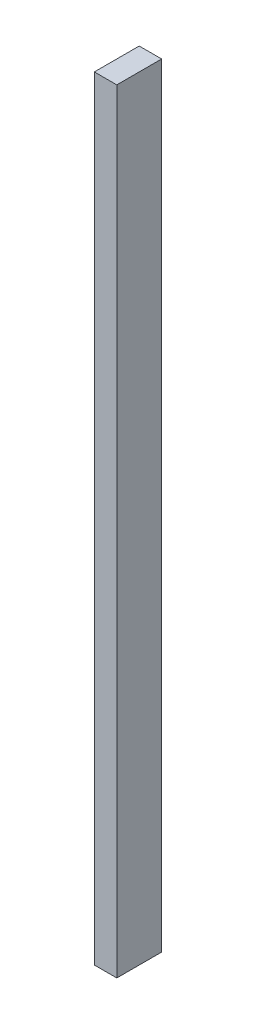
ISO-10303-21;
HEADER;
FILE_DESCRIPTION(('STEP AP214'),'2;1');
FILE_NAME('part.step','',(''),(''),'','','');
FILE_SCHEMA(('AUTOMOTIVE_DESIGN { 1 0 10303 214 1 1 1 1 }'));
ENDSEC;
DATA;
#1=APPLICATION_CONTEXT('core data for automotive mechanical design processes');
#2=APPLICATION_PROTOCOL_DEFINITION('international standard','automotive_design',2000,#1);
#3=PRODUCT_CONTEXT('',#1,'mechanical');
#4=PRODUCT('Part','Part','',(#3));
#5=PRODUCT_RELATED_PRODUCT_CATEGORY('part','',(#4));
#6=PRODUCT_DEFINITION_FORMATION('','',#4);
#7=PRODUCT_DEFINITION_CONTEXT('part definition',#1,'design');
#8=PRODUCT_DEFINITION('design','',#6,#7);
#9=PRODUCT_DEFINITION_SHAPE('','',#8);
#10=(LENGTH_UNIT() NAMED_UNIT(*) SI_UNIT(.MILLI.,.METRE.));
#11=(NAMED_UNIT(*) PLANE_ANGLE_UNIT() SI_UNIT($,.RADIAN.));
#12=(NAMED_UNIT(*) SI_UNIT($,.STERADIAN.) SOLID_ANGLE_UNIT());
#13=UNCERTAINTY_MEASURE_WITH_UNIT(LENGTH_MEASURE(1.E-05),#10,'distance_accuracy_value','');
#14=(GEOMETRIC_REPRESENTATION_CONTEXT(3) GLOBAL_UNCERTAINTY_ASSIGNED_CONTEXT((#13)) GLOBAL_UNIT_ASSIGNED_CONTEXT((#10,
#11,#12)) REPRESENTATION_CONTEXT('',''));
#15=CARTESIAN_POINT('',(0.,0.,0.));
#16=DIRECTION('',(0.,0.,1.));
#17=DIRECTION('',(1.,0.,0.));
#18=AXIS2_PLACEMENT_3D('',#15,#16,#17);
#19=CARTESIAN_POINT('',(12.7,875.792,25.4));
#20=DIRECTION('',(-1.,0.,0.));
#21=DIRECTION('',(0.,0.,1.));
#22=AXIS2_PLACEMENT_3D('',#19,#20,#21);
#23=PLANE('',#22);
#24=DIRECTION('',(0.,0.,-1.));
#25=VECTOR('',#24,1.);
#26=CARTESIAN_POINT('',(12.7,0.,25.4));
#27=LINE('',#26,#25);
#28=CARTESIAN_POINT('',(12.7,0.,25.4));
#29=VERTEX_POINT('',#28);
#30=CARTESIAN_POINT('',(12.7,0.,-25.4));
#31=VERTEX_POINT('',#30);
#32=EDGE_CURVE('E111',#29,#31,#27,.T.);
#33=ORIENTED_EDGE('',*,*,#32,.T.);
#34=DIRECTION('',(0.,-1.,0.));
#35=VECTOR('',#34,1.);
#36=CARTESIAN_POINT('',(12.7,875.792,-25.4));
#37=LINE('',#36,#35);
#38=CARTESIAN_POINT('',(12.7,875.792,-25.4));
#39=VERTEX_POINT('',#38);
#40=EDGE_CURVE('E11',#39,#31,#37,.T.);
#41=ORIENTED_EDGE('',*,*,#40,.F.);
#42=DIRECTION('',(0.,0.,-1.));
#43=VECTOR('',#42,1.);
#44=CARTESIAN_POINT('',(12.7,875.792,25.4));
#45=LINE('',#44,#43);
#46=CARTESIAN_POINT('',(12.7,875.792,25.4));
#47=VERTEX_POINT('',#46);
#48=EDGE_CURVE('E95',#47,#39,#45,.T.);
#49=ORIENTED_EDGE('',*,*,#48,.F.);
#50=DIRECTION('',(0.,-1.,0.));
#51=VECTOR('',#50,1.);
#52=CARTESIAN_POINT('',(12.7,875.792,25.4));
#53=LINE('',#52,#51);
#54=EDGE_CURVE('E107',#47,#29,#53,.T.);
#55=ORIENTED_EDGE('',*,*,#54,.T.);
#56=EDGE_LOOP('',(#33,#41,#49,#55));
#57=FACE_BOUND('',#56,.T.);
#58=ADVANCED_FACE('F43',(#57),#23,.F.);
#59=CARTESIAN_POINT('',(-12.7,875.792,-25.4));
#60=DIRECTION('',(0.,0.,1.));
#61=DIRECTION('',(1.,0.,0.));
#62=AXIS2_PLACEMENT_3D('',#59,#60,#61);
#63=PLANE('',#62);
#64=DIRECTION('',(-1.,0.,0.));
#65=VECTOR('',#64,1.);
#66=CARTESIAN_POINT('',(-12.7,0.,-25.4));
#67=LINE('',#66,#65);
#68=CARTESIAN_POINT('',(-12.7,0.,-25.4));
#69=VERTEX_POINT('',#68);
#70=EDGE_CURVE('E100',#31,#69,#67,.T.);
#71=ORIENTED_EDGE('',*,*,#70,.T.);
#72=DIRECTION('',(0.,-1.,0.));
#73=VECTOR('',#72,1.);
#74=CARTESIAN_POINT('',(-12.7,875.792,-25.4));
#75=LINE('',#74,#73);
#76=CARTESIAN_POINT('',(-12.7,875.792,-25.4));
#77=VERTEX_POINT('',#76);
#78=EDGE_CURVE('E52',#77,#69,#75,.T.);
#79=ORIENTED_EDGE('',*,*,#78,.F.);
#80=DIRECTION('',(-1.,0.,0.));
#81=VECTOR('',#80,1.);
#82=CARTESIAN_POINT('',(-12.7,875.792,-25.4));
#83=LINE('',#82,#81);
#84=EDGE_CURVE('E90',#39,#77,#83,.T.);
#85=ORIENTED_EDGE('',*,*,#84,.F.);
#86=ORIENTED_EDGE('',*,*,#40,.T.);
#87=EDGE_LOOP('',(#71,#79,#85,#86));
#88=FACE_BOUND('',#87,.T.);
#89=ADVANCED_FACE('F99',(#88),#63,.F.);
#90=CARTESIAN_POINT('',(-12.7,875.792,25.4));
#91=DIRECTION('',(1.,0.,0.));
#92=DIRECTION('',(0.,0.,-1.));
#93=AXIS2_PLACEMENT_3D('',#90,#91,#92);
#94=PLANE('',#93);
#95=DIRECTION('',(0.,0.,1.));
#96=VECTOR('',#95,1.);
#97=CARTESIAN_POINT('',(-12.7,0.,25.4));
#98=LINE('',#97,#96);
#99=CARTESIAN_POINT('',(-12.7,0.,25.4));
#100=VERTEX_POINT('',#99);
#101=EDGE_CURVE('E77',#69,#100,#98,.T.);
#102=ORIENTED_EDGE('',*,*,#101,.T.);
#103=DIRECTION('',(0.,-1.,0.));
#104=VECTOR('',#103,1.);
#105=CARTESIAN_POINT('',(-12.7,875.792,25.4));
#106=LINE('',#105,#104);
#107=CARTESIAN_POINT('',(-12.7,875.792,25.4));
#108=VERTEX_POINT('',#107);
#109=EDGE_CURVE('E102',#108,#100,#106,.T.);
#110=ORIENTED_EDGE('',*,*,#109,.F.);
#111=DIRECTION('',(0.,0.,1.));
#112=VECTOR('',#111,1.);
#113=CARTESIAN_POINT('',(-12.7,875.792,25.4));
#114=LINE('',#113,#112);
#115=EDGE_CURVE('E93',#77,#108,#114,.T.);
#116=ORIENTED_EDGE('',*,*,#115,.F.);
#117=ORIENTED_EDGE('',*,*,#78,.T.);
#118=EDGE_LOOP('',(#102,#110,#116,#117));
#119=FACE_BOUND('',#118,.T.);
#120=ADVANCED_FACE('F103',(#119),#94,.F.);
#121=CARTESIAN_POINT('',(-12.7,875.792,25.4));
#122=DIRECTION('',(0.,0.,-1.));
#123=DIRECTION('',(-1.,0.,0.));
#124=AXIS2_PLACEMENT_3D('',#121,#122,#123);
#125=PLANE('',#124);
#126=DIRECTION('',(1.,0.,0.));
#127=VECTOR('',#126,1.);
#128=CARTESIAN_POINT('',(-12.7,0.,25.4));
#129=LINE('',#128,#127);
#130=EDGE_CURVE('E83',#100,#29,#129,.T.);
#131=ORIENTED_EDGE('',*,*,#130,.T.);
#132=ORIENTED_EDGE('',*,*,#54,.F.);
#133=DIRECTION('',(1.,0.,0.));
#134=VECTOR('',#133,1.);
#135=CARTESIAN_POINT('',(-12.7,875.792,25.4));
#136=LINE('',#135,#134);
#137=EDGE_CURVE('E60',#108,#47,#136,.T.);
#138=ORIENTED_EDGE('',*,*,#137,.F.);
#139=ORIENTED_EDGE('',*,*,#109,.T.);
#140=EDGE_LOOP('',(#131,#132,#138,#139));
#141=FACE_BOUND('',#140,.T.);
#142=ADVANCED_FACE('F124',(#141),#125,.F.);
#143=CARTESIAN_POINT('',(0.,875.792,0.));
#144=DIRECTION('',(0.,-1.,0.));
#145=DIRECTION('',(0.,0.,-1.));
#146=AXIS2_PLACEMENT_3D('',#143,#144,#145);
#147=PLANE('',#146);
#148=ORIENTED_EDGE('',*,*,#48,.T.);
#149=ORIENTED_EDGE('',*,*,#84,.T.);
#150=ORIENTED_EDGE('',*,*,#115,.T.);
#151=ORIENTED_EDGE('',*,*,#137,.T.);
#152=EDGE_LOOP('',(#148,#149,#150,#151));
#153=FACE_BOUND('',#152,.T.);
#154=ADVANCED_FACE('F91',(#153),#147,.F.);
#155=CARTESIAN_POINT('',(0.,0.,0.));
#156=DIRECTION('',(0.,-1.,0.));
#157=DIRECTION('',(0.,0.,-1.));
#158=AXIS2_PLACEMENT_3D('',#155,#156,#157);
#159=PLANE('',#158);
#160=ORIENTED_EDGE('',*,*,#32,.F.);
#161=ORIENTED_EDGE('',*,*,#130,.F.);
#162=ORIENTED_EDGE('',*,*,#101,.F.);
#163=ORIENTED_EDGE('',*,*,#70,.F.);
#164=EDGE_LOOP('',(#160,#161,#162,#163));
#165=FACE_BOUND('',#164,.T.);
#166=ADVANCED_FACE('F127',(#165),#159,.T.);
#167=CLOSED_SHELL('',(#58,#89,#120,#142,#154,#166));
#168=MANIFOLD_SOLID_BREP('B2',#167);
#169=ADVANCED_BREP_SHAPE_REPRESENTATION('',(#18,#168),#14);
#170=SHAPE_DEFINITION_REPRESENTATION(#9,#169);
ENDSEC;
END-ISO-10303-21;
